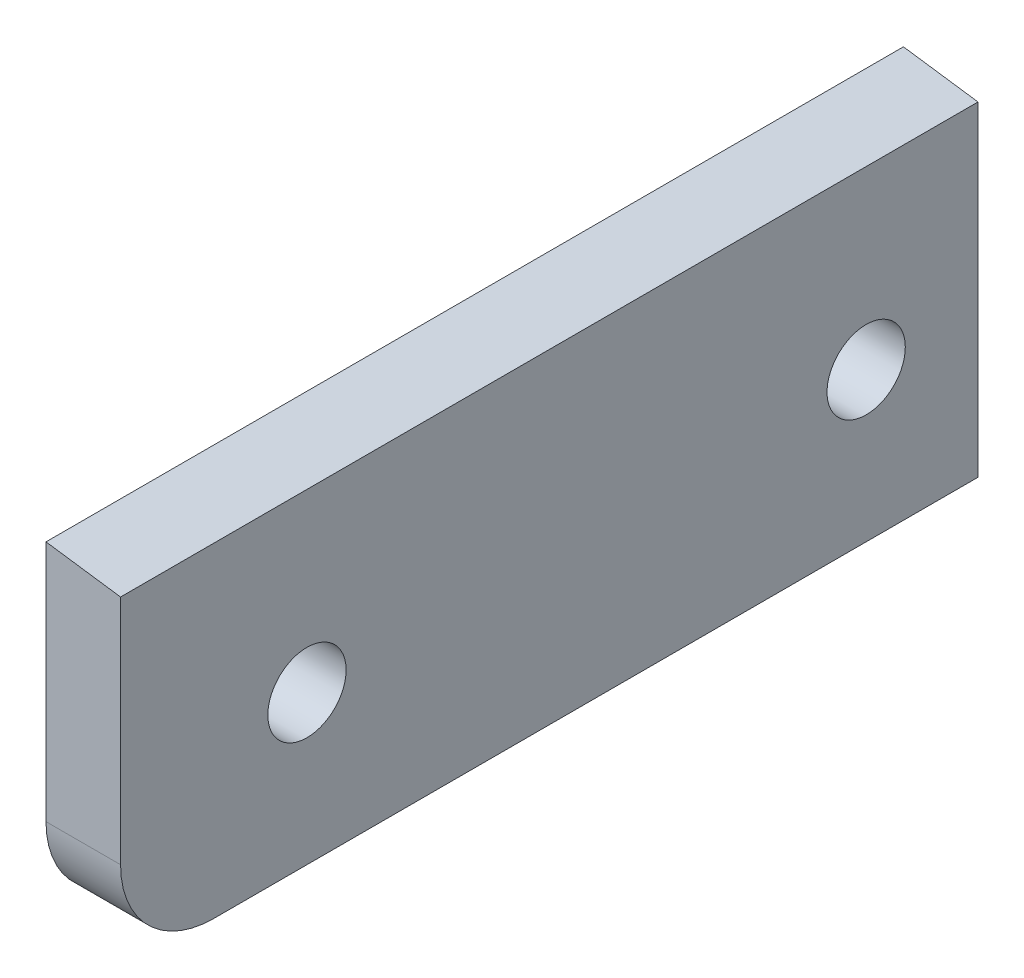
ISO-10303-21;
HEADER;
FILE_DESCRIPTION(('STEP AP214'),'2;1');
FILE_NAME('part.step','',(''),(''),'','','');
FILE_SCHEMA(('AUTOMOTIVE_DESIGN { 1 0 10303 214 1 1 1 1 }'));
ENDSEC;
DATA;
#1=APPLICATION_CONTEXT('core data for automotive mechanical design processes');
#2=APPLICATION_PROTOCOL_DEFINITION('international standard','automotive_design',2000,#1);
#3=PRODUCT_CONTEXT('',#1,'mechanical');
#4=PRODUCT('Part','Part','',(#3));
#5=PRODUCT_RELATED_PRODUCT_CATEGORY('part','',(#4));
#6=PRODUCT_DEFINITION_FORMATION('','',#4);
#7=PRODUCT_DEFINITION_CONTEXT('part definition',#1,'design');
#8=PRODUCT_DEFINITION('design','',#6,#7);
#9=PRODUCT_DEFINITION_SHAPE('','',#8);
#10=(LENGTH_UNIT() NAMED_UNIT(*) SI_UNIT(.MILLI.,.METRE.));
#11=(NAMED_UNIT(*) PLANE_ANGLE_UNIT() SI_UNIT($,.RADIAN.));
#12=(NAMED_UNIT(*) SI_UNIT($,.STERADIAN.) SOLID_ANGLE_UNIT());
#13=UNCERTAINTY_MEASURE_WITH_UNIT(LENGTH_MEASURE(1.E-05),#10,'distance_accuracy_value','');
#14=(GEOMETRIC_REPRESENTATION_CONTEXT(3) GLOBAL_UNCERTAINTY_ASSIGNED_CONTEXT((#13)) GLOBAL_UNIT_ASSIGNED_CONTEXT((#10,
#11,#12)) REPRESENTATION_CONTEXT('',''));
#15=CARTESIAN_POINT('',(0.,0.,0.));
#16=DIRECTION('',(0.,0.,1.));
#17=DIRECTION('',(1.,0.,0.));
#18=AXIS2_PLACEMENT_3D('',#15,#16,#17);
#19=CARTESIAN_POINT('',(0.,0.,46.));
#20=DIRECTION('',(1.,0.,0.));
#21=DIRECTION('',(0.,0.,-1.));
#22=AXIS2_PLACEMENT_3D('',#19,#20,#21);
#23=PLANE('',#22);
#24=CARTESIAN_POINT('',(0.,8.,6.));
#25=DIRECTION('',(1.,0.,0.));
#26=DIRECTION('',(0.,0.,-1.));
#27=AXIS2_PLACEMENT_3D('',#24,#25,#26);
#28=CIRCLE('',#27,2.1);
#29=CARTESIAN_POINT('',(0.,8.,3.9));
#30=VERTEX_POINT('',#29);
#31=EDGE_CURVE('E133',#30,#30,#28,.T.);
#32=ORIENTED_EDGE('',*,*,#31,.T.);
#33=EDGE_LOOP('',(#32));
#34=FACE_BOUND('',#33,.T.);
#35=CARTESIAN_POINT('',(0.,7.99999999999999,36.));
#36=DIRECTION('',(1.,0.,0.));
#37=DIRECTION('',(0.,0.,-1.));
#38=AXIS2_PLACEMENT_3D('',#35,#36,#37);
#39=CIRCLE('',#38,2.1);
#40=CARTESIAN_POINT('',(0.,7.99999999999999,33.9));
#41=VERTEX_POINT('',#40);
#42=EDGE_CURVE('E110',#41,#41,#39,.T.);
#43=ORIENTED_EDGE('',*,*,#42,.T.);
#44=EDGE_LOOP('',(#43));
#45=FACE_BOUND('',#44,.T.);
#46=DIRECTION('',(0.,0.,-1.));
#47=VECTOR('',#46,1.);
#48=CARTESIAN_POINT('',(0.,0.,46.));
#49=LINE('',#48,#47);
#50=CARTESIAN_POINT('',(0.,0.,41.));
#51=VERTEX_POINT('',#50);
#52=CARTESIAN_POINT('',(0.,0.,0.));
#53=VERTEX_POINT('',#52);
#54=EDGE_CURVE('E117',#51,#53,#49,.T.);
#55=ORIENTED_EDGE('',*,*,#54,.F.);
#56=CARTESIAN_POINT('',(0.,5.,41.));
#57=DIRECTION('',(1.,0.,0.));
#58=DIRECTION('',(0.,0.,-1.));
#59=AXIS2_PLACEMENT_3D('',#56,#57,#58);
#60=CIRCLE('',#59,5.);
#61=CARTESIAN_POINT('',(0.,5.,46.));
#62=VERTEX_POINT('',#61);
#63=EDGE_CURVE('E11',#51,#62,#60,.F.);
#64=ORIENTED_EDGE('',*,*,#63,.T.);
#65=DIRECTION('',(0.,-1.,0.));
#66=VECTOR('',#65,1.);
#67=CARTESIAN_POINT('',(0.,0.,46.));
#68=LINE('',#67,#66);
#69=CARTESIAN_POINT('',(0.,18.,46.));
#70=VERTEX_POINT('',#69);
#71=EDGE_CURVE('E87',#70,#62,#68,.T.);
#72=ORIENTED_EDGE('',*,*,#71,.F.);
#73=DIRECTION('',(0.,0.,-1.));
#74=VECTOR('',#73,1.);
#75=CARTESIAN_POINT('',(0.,18.,46.));
#76=LINE('',#75,#74);
#77=CARTESIAN_POINT('',(0.,18.,0.));
#78=VERTEX_POINT('',#77);
#79=EDGE_CURVE('E97',#70,#78,#76,.T.);
#80=ORIENTED_EDGE('',*,*,#79,.T.);
#81=DIRECTION('',(0.,-1.,0.));
#82=VECTOR('',#81,1.);
#83=CARTESIAN_POINT('',(0.,0.,0.));
#84=LINE('',#83,#82);
#85=EDGE_CURVE('E106',#78,#53,#84,.T.);
#86=ORIENTED_EDGE('',*,*,#85,.T.);
#87=EDGE_LOOP('',(#55,#64,#72,#80,#86));
#88=FACE_BOUND('',#87,.T.);
#89=ADVANCED_FACE('F34',(#34,#45,#88),#23,.F.);
#90=CARTESIAN_POINT('',(0.,0.,46.));
#91=DIRECTION('',(0.,1.,0.));
#92=DIRECTION('',(0.,0.,1.));
#93=AXIS2_PLACEMENT_3D('',#90,#91,#92);
#94=PLANE('',#93);
#95=DIRECTION('',(0.,0.,-1.));
#96=VECTOR('',#95,1.);
#97=CARTESIAN_POINT('',(4.,0.,46.));
#98=LINE('',#97,#96);
#99=CARTESIAN_POINT('',(4.,0.,41.));
#100=VERTEX_POINT('',#99);
#101=CARTESIAN_POINT('',(4.,0.,0.));
#102=VERTEX_POINT('',#101);
#103=EDGE_CURVE('E96',#100,#102,#98,.T.);
#104=ORIENTED_EDGE('',*,*,#103,.F.);
#105=DIRECTION('',(1.,0.,0.));
#106=VECTOR('',#105,1.);
#107=CARTESIAN_POINT('',(0.,0.,41.));
#108=LINE('',#107,#106);
#109=EDGE_CURVE('E42',#100,#51,#108,.F.);
#110=ORIENTED_EDGE('',*,*,#109,.T.);
#111=ORIENTED_EDGE('',*,*,#54,.T.);
#112=DIRECTION('',(1.,0.,0.));
#113=VECTOR('',#112,1.);
#114=CARTESIAN_POINT('',(0.,0.,0.));
#115=LINE('',#114,#113);
#116=EDGE_CURVE('E109',#53,#102,#115,.T.);
#117=ORIENTED_EDGE('',*,*,#116,.T.);
#118=EDGE_LOOP('',(#104,#110,#111,#117));
#119=FACE_BOUND('',#118,.T.);
#120=ADVANCED_FACE('F121',(#119),#94,.F.);
#121=CARTESIAN_POINT('',(4.,0.,46.));
#122=DIRECTION('',(-1.,0.,0.));
#123=DIRECTION('',(0.,0.,1.));
#124=AXIS2_PLACEMENT_3D('',#121,#122,#123);
#125=PLANE('',#124);
#126=CARTESIAN_POINT('',(4.,8.,6.));
#127=DIRECTION('',(1.,0.,0.));
#128=DIRECTION('',(0.,0.,-1.));
#129=AXIS2_PLACEMENT_3D('',#126,#127,#128);
#130=CIRCLE('',#129,2.09999999999999);
#131=CARTESIAN_POINT('',(4.,8.,3.90000000000001));
#132=VERTEX_POINT('',#131);
#133=EDGE_CURVE('E136',#132,#132,#130,.T.);
#134=ORIENTED_EDGE('',*,*,#133,.F.);
#135=EDGE_LOOP('',(#134));
#136=FACE_BOUND('',#135,.T.);
#137=CARTESIAN_POINT('',(4.,7.99999999999999,36.));
#138=DIRECTION('',(1.,0.,0.));
#139=DIRECTION('',(0.,0.,-1.));
#140=AXIS2_PLACEMENT_3D('',#137,#138,#139);
#141=CIRCLE('',#140,2.09999999999999);
#142=CARTESIAN_POINT('',(4.,7.99999999999999,33.9));
#143=VERTEX_POINT('',#142);
#144=EDGE_CURVE('E130',#143,#143,#141,.T.);
#145=ORIENTED_EDGE('',*,*,#144,.F.);
#146=EDGE_LOOP('',(#145));
#147=FACE_BOUND('',#146,.T.);
#148=DIRECTION('',(0.,1.,0.));
#149=VECTOR('',#148,1.);
#150=CARTESIAN_POINT('',(4.,0.,46.));
#151=LINE('',#150,#149);
#152=CARTESIAN_POINT('',(4.,5.,46.));
#153=VERTEX_POINT('',#152);
#154=CARTESIAN_POINT('',(4.,17.4378366611904,46.));
#155=VERTEX_POINT('',#154);
#156=EDGE_CURVE('E78',#153,#155,#151,.T.);
#157=ORIENTED_EDGE('',*,*,#156,.F.);
#158=CARTESIAN_POINT('',(4.,5.,41.));
#159=DIRECTION('',(-1.,0.,0.));
#160=DIRECTION('',(0.,0.,1.));
#161=AXIS2_PLACEMENT_3D('',#158,#159,#160);
#162=CIRCLE('',#161,5.);
#163=EDGE_CURVE('E56',#153,#100,#162,.F.);
#164=ORIENTED_EDGE('',*,*,#163,.T.);
#165=ORIENTED_EDGE('',*,*,#103,.T.);
#166=DIRECTION('',(0.,1.,0.));
#167=VECTOR('',#166,1.);
#168=CARTESIAN_POINT('',(4.,0.,0.));
#169=LINE('',#168,#167);
#170=CARTESIAN_POINT('',(4.,17.4378366611904,0.));
#171=VERTEX_POINT('',#170);
#172=EDGE_CURVE('E93',#102,#171,#169,.T.);
#173=ORIENTED_EDGE('',*,*,#172,.T.);
#174=DIRECTION('',(0.,0.,-1.));
#175=VECTOR('',#174,1.);
#176=CARTESIAN_POINT('',(4.,17.4378366611904,46.));
#177=LINE('',#176,#175);
#178=EDGE_CURVE('E90',#155,#171,#177,.T.);
#179=ORIENTED_EDGE('',*,*,#178,.F.);
#180=EDGE_LOOP('',(#157,#164,#165,#173,#179));
#181=FACE_BOUND('',#180,.T.);
#182=ADVANCED_FACE('F91',(#136,#147,#181),#125,.F.);
#183=CARTESIAN_POINT('',(0.,18.,46.));
#184=DIRECTION('',(-0.139173100960066,-0.99026806874157,0.));
#185=DIRECTION('',(0.99026806874157,-0.139173100960066,0.));
#186=AXIS2_PLACEMENT_3D('',#183,#184,#185);
#187=PLANE('',#186);
#188=DIRECTION('',(-0.99026806874157,0.139173100960066,0.));
#189=VECTOR('',#188,1.);
#190=CARTESIAN_POINT('',(0.,18.,0.));
#191=LINE('',#190,#189);
#192=EDGE_CURVE('E114',#171,#78,#191,.T.);
#193=ORIENTED_EDGE('',*,*,#192,.T.);
#194=ORIENTED_EDGE('',*,*,#79,.F.);
#195=DIRECTION('',(-0.99026806874157,0.139173100960066,0.));
#196=VECTOR('',#195,1.);
#197=CARTESIAN_POINT('',(0.,18.,46.));
#198=LINE('',#197,#196);
#199=EDGE_CURVE('E83',#155,#70,#198,.T.);
#200=ORIENTED_EDGE('',*,*,#199,.F.);
#201=ORIENTED_EDGE('',*,*,#178,.T.);
#202=EDGE_LOOP('',(#193,#194,#200,#201));
#203=FACE_BOUND('',#202,.T.);
#204=ADVANCED_FACE('F99',(#203),#187,.F.);
#205=CARTESIAN_POINT('',(0.,0.,46.));
#206=DIRECTION('',(0.,0.,-1.));
#207=DIRECTION('',(-1.,0.,0.));
#208=AXIS2_PLACEMENT_3D('',#205,#206,#207);
#209=PLANE('',#208);
#210=ORIENTED_EDGE('',*,*,#71,.T.);
#211=DIRECTION('',(1.,0.,0.));
#212=VECTOR('',#211,1.);
#213=CARTESIAN_POINT('',(0.,5.,46.));
#214=LINE('',#213,#212);
#215=EDGE_CURVE('E86',#62,#153,#214,.T.);
#216=ORIENTED_EDGE('',*,*,#215,.T.);
#217=ORIENTED_EDGE('',*,*,#156,.T.);
#218=ORIENTED_EDGE('',*,*,#199,.T.);
#219=EDGE_LOOP('',(#210,#216,#217,#218));
#220=FACE_BOUND('',#219,.T.);
#221=ADVANCED_FACE('F81',(#220),#209,.F.);
#222=CARTESIAN_POINT('',(0.,0.,0.));
#223=DIRECTION('',(0.,0.,-1.));
#224=DIRECTION('',(-1.,0.,0.));
#225=AXIS2_PLACEMENT_3D('',#222,#223,#224);
#226=PLANE('',#225);
#227=ORIENTED_EDGE('',*,*,#85,.F.);
#228=ORIENTED_EDGE('',*,*,#192,.F.);
#229=ORIENTED_EDGE('',*,*,#172,.F.);
#230=ORIENTED_EDGE('',*,*,#116,.F.);
#231=EDGE_LOOP('',(#227,#228,#229,#230));
#232=FACE_BOUND('',#231,.T.);
#233=ADVANCED_FACE('F126',(#232),#226,.T.);
#234=CARTESIAN_POINT('',(0.,5.,41.));
#235=DIRECTION('',(1.,0.,0.));
#236=DIRECTION('',(0.,0.,-1.));
#237=AXIS2_PLACEMENT_3D('',#234,#235,#236);
#238=CYLINDRICAL_SURFACE('',#237,5.);
#239=ORIENTED_EDGE('',*,*,#63,.F.);
#240=ORIENTED_EDGE('',*,*,#109,.F.);
#241=ORIENTED_EDGE('',*,*,#163,.F.);
#242=ORIENTED_EDGE('',*,*,#215,.F.);
#243=EDGE_LOOP('',(#239,#240,#241,#242));
#244=FACE_BOUND('',#243,.T.);
#245=ADVANCED_FACE('F36',(#244),#238,.T.);
#246=CARTESIAN_POINT('',(4.,7.99999999999999,36.));
#247=DIRECTION('',(1.,0.,0.));
#248=DIRECTION('',(0.,0.,-1.));
#249=AXIS2_PLACEMENT_3D('',#246,#247,#248);
#250=CYLINDRICAL_SURFACE('',#249,2.09999999999999);
#251=ORIENTED_EDGE('',*,*,#42,.F.);
#252=EDGE_LOOP('',(#251));
#253=FACE_BOUND('',#252,.T.);
#254=ORIENTED_EDGE('',*,*,#144,.T.);
#255=EDGE_LOOP('',(#254));
#256=FACE_BOUND('',#255,.T.);
#257=ADVANCED_FACE('F147',(#253,#256),#250,.F.);
#258=CARTESIAN_POINT('',(4.,8.,6.));
#259=DIRECTION('',(1.,0.,0.));
#260=DIRECTION('',(0.,0.,-1.));
#261=AXIS2_PLACEMENT_3D('',#258,#259,#260);
#262=CYLINDRICAL_SURFACE('',#261,2.09999999999999);
#263=ORIENTED_EDGE('',*,*,#31,.F.);
#264=EDGE_LOOP('',(#263));
#265=FACE_BOUND('',#264,.T.);
#266=ORIENTED_EDGE('',*,*,#133,.T.);
#267=EDGE_LOOP('',(#266));
#268=FACE_BOUND('',#267,.T.);
#269=ADVANCED_FACE('F140',(#265,#268),#262,.F.);
#270=CLOSED_SHELL('',(#89,#120,#182,#204,#221,#233,#245,#257,#269));
#271=MANIFOLD_SOLID_BREP('B2',#270);
#272=ADVANCED_BREP_SHAPE_REPRESENTATION('',(#18,#271),#14);
#273=SHAPE_DEFINITION_REPRESENTATION(#9,#272);
ENDSEC;
END-ISO-10303-21;
